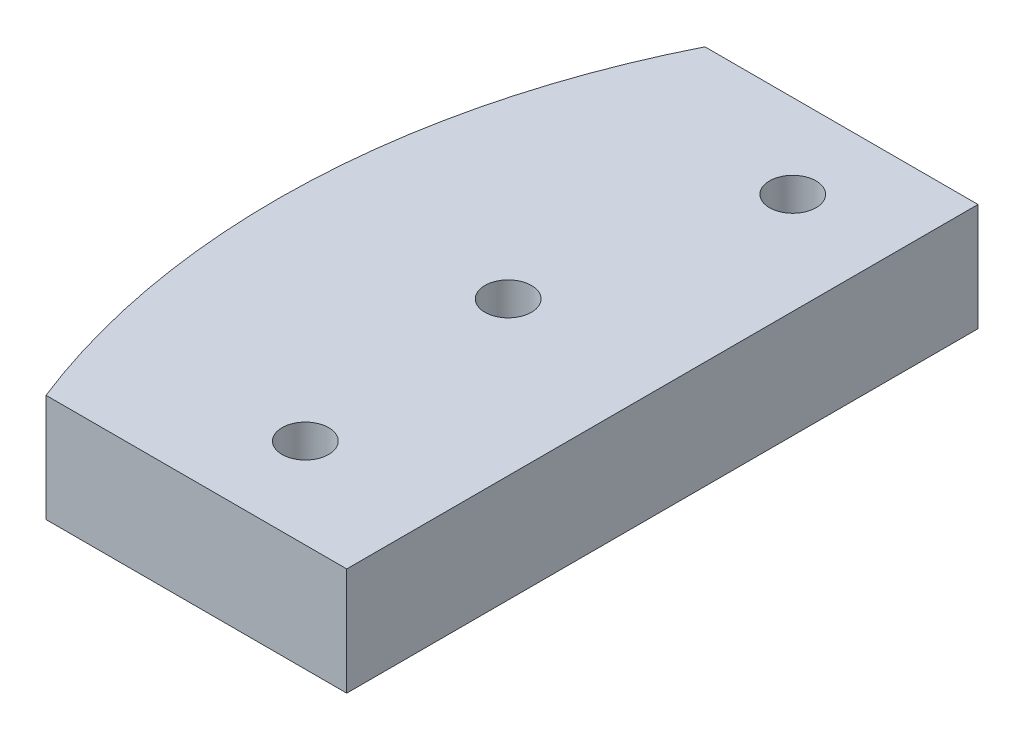
ISO-10303-21;
HEADER;
FILE_DESCRIPTION(('STEP AP214'),'2;1');
FILE_NAME('part.step','',(''),(''),'','','');
FILE_SCHEMA(('AUTOMOTIVE_DESIGN { 1 0 10303 214 1 1 1 1 }'));
ENDSEC;
DATA;
#1=APPLICATION_CONTEXT('core data for automotive mechanical design processes');
#2=APPLICATION_PROTOCOL_DEFINITION('international standard','automotive_design',2000,#1);
#3=PRODUCT_CONTEXT('',#1,'mechanical');
#4=PRODUCT('Part','Part','',(#3));
#5=PRODUCT_RELATED_PRODUCT_CATEGORY('part','',(#4));
#6=PRODUCT_DEFINITION_FORMATION('','',#4);
#7=PRODUCT_DEFINITION_CONTEXT('part definition',#1,'design');
#8=PRODUCT_DEFINITION('design','',#6,#7);
#9=PRODUCT_DEFINITION_SHAPE('','',#8);
#10=(LENGTH_UNIT() NAMED_UNIT(*) SI_UNIT(.MILLI.,.METRE.));
#11=(NAMED_UNIT(*) PLANE_ANGLE_UNIT() SI_UNIT($,.RADIAN.));
#12=(NAMED_UNIT(*) SI_UNIT($,.STERADIAN.) SOLID_ANGLE_UNIT());
#13=UNCERTAINTY_MEASURE_WITH_UNIT(LENGTH_MEASURE(1.E-05),#10,'distance_accuracy_value','');
#14=(GEOMETRIC_REPRESENTATION_CONTEXT(3) GLOBAL_UNCERTAINTY_ASSIGNED_CONTEXT((#13)) GLOBAL_UNIT_ASSIGNED_CONTEXT((#10,
#11,#12)) REPRESENTATION_CONTEXT('',''));
#15=CARTESIAN_POINT('',(0.,0.,0.));
#16=DIRECTION('',(0.,0.,1.));
#17=DIRECTION('',(1.,0.,0.));
#18=AXIS2_PLACEMENT_3D('',#15,#16,#17);
#19=CARTESIAN_POINT('',(-40.2,15.,12.9987228872584));
#20=DIRECTION('',(0.,1.,0.));
#21=DIRECTION('',(-1.,0.,0.));
#22=AXIS2_PLACEMENT_3D('',#19,#20,#21);
#23=PLANE('',#22);
#24=CARTESIAN_POINT('',(-78.,15.,0.100000000000003));
#25=DIRECTION('',(0.,1.,0.));
#26=DIRECTION('',(-1.,0.,0.));
#27=AXIS2_PLACEMENT_3D('',#24,#25,#26);
#28=CIRCLE('',#27,2.25);
#29=CARTESIAN_POINT('',(-80.25,15.,0.100000000000003));
#30=VERTEX_POINT('',#29);
#31=EDGE_CURVE('E125',#30,#30,#28,.F.);
#32=ORIENTED_EDGE('',*,*,#31,.F.);
#33=EDGE_LOOP('',(#32));
#34=FACE_BOUND('',#33,.T.);
#35=DIRECTION('',(0.,0.,1.));
#36=VECTOR('',#35,1.);
#37=CARTESIAN_POINT('',(-63.2,15.,-33.5));
#38=LINE('',#37,#36);
#39=CARTESIAN_POINT('',(-63.2,15.,-30.5));
#40=VERTEX_POINT('',#39);
#41=CARTESIAN_POINT('',(-63.2,15.,30.5));
#42=VERTEX_POINT('',#41);
#43=EDGE_CURVE('E14',#40,#42,#38,.T.);
#44=ORIENTED_EDGE('',*,*,#43,.T.);
#45=DIRECTION('',(1.,0.,0.));
#46=VECTOR('',#45,1.);
#47=CARTESIAN_POINT('',(0.,15.,30.5));
#48=LINE('',#47,#46);
#49=CARTESIAN_POINT('',(-92.2616921937509,15.,30.5));
#50=VERTEX_POINT('',#49);
#51=EDGE_CURVE('E70',#50,#42,#48,.T.);
#52=ORIENTED_EDGE('',*,*,#51,.F.);
#53=CARTESIAN_POINT('',(-22.6589151875398,15.,2.99288439458776));
#54=DIRECTION('',(0.,1.,0.));
#55=DIRECTION('',(-1.,0.,0.));
#56=AXIS2_PLACEMENT_3D('',#53,#54,#55);
#57=CIRCLE('',#56,74.8410848124602);
#58=CARTESIAN_POINT('',(-89.5873446539231,15.,-30.5));
#59=VERTEX_POINT('',#58);
#60=EDGE_CURVE('E133',#50,#59,#57,.F.);
#61=ORIENTED_EDGE('',*,*,#60,.T.);
#62=DIRECTION('',(1.,0.,0.));
#63=VECTOR('',#62,1.);
#64=CARTESIAN_POINT('',(0.,15.,-30.5));
#65=LINE('',#64,#63);
#66=EDGE_CURVE('E62',#59,#40,#65,.T.);
#67=ORIENTED_EDGE('',*,*,#66,.T.);
#68=EDGE_LOOP('',(#44,#52,#61,#67));
#69=FACE_BOUND('',#68,.T.);
#70=CARTESIAN_POINT('',(-73.,15.,-22.4));
#71=DIRECTION('',(0.,1.,0.));
#72=DIRECTION('',(-1.,0.,0.));
#73=AXIS2_PLACEMENT_3D('',#70,#71,#72);
#74=CIRCLE('',#73,2.25);
#75=CARTESIAN_POINT('',(-75.25,15.,-22.4));
#76=VERTEX_POINT('',#75);
#77=EDGE_CURVE('E119',#76,#76,#74,.F.);
#78=ORIENTED_EDGE('',*,*,#77,.F.);
#79=EDGE_LOOP('',(#78));
#80=FACE_BOUND('',#79,.T.);
#81=CARTESIAN_POINT('',(-75.9,15.,21.8));
#82=DIRECTION('',(0.,1.,0.));
#83=DIRECTION('',(-1.,0.,0.));
#84=AXIS2_PLACEMENT_3D('',#81,#82,#83);
#85=CIRCLE('',#84,2.25);
#86=CARTESIAN_POINT('',(-78.15,15.,21.8));
#87=VERTEX_POINT('',#86);
#88=EDGE_CURVE('E56',#87,#87,#85,.F.);
#89=ORIENTED_EDGE('',*,*,#88,.F.);
#90=EDGE_LOOP('',(#89));
#91=FACE_BOUND('',#90,.T.);
#92=ADVANCED_FACE('F53',(#34,#69,#80,#91),#23,.F.);
#93=CARTESIAN_POINT('',(0.,25.4,0.));
#94=DIRECTION('',(0.,-1.,0.));
#95=DIRECTION('',(0.,0.,-1.));
#96=AXIS2_PLACEMENT_3D('',#93,#94,#95);
#97=PLANE('',#96);
#98=CARTESIAN_POINT('',(-73.,25.4,-22.4));
#99=DIRECTION('',(0.,-1.,0.));
#100=DIRECTION('',(0.,0.,-1.));
#101=AXIS2_PLACEMENT_3D('',#98,#99,#100);
#102=CIRCLE('',#101,2.25);
#103=CARTESIAN_POINT('',(-73.,25.4,-24.65));
#104=VERTEX_POINT('',#103);
#105=EDGE_CURVE('E269',#104,#104,#102,.T.);
#106=ORIENTED_EDGE('',*,*,#105,.T.);
#107=EDGE_LOOP('',(#106));
#108=FACE_BOUND('',#107,.T.);
#109=CARTESIAN_POINT('',(-78.,25.4,0.100000000000003));
#110=DIRECTION('',(0.,-1.,0.));
#111=DIRECTION('',(0.,0.,-1.));
#112=AXIS2_PLACEMENT_3D('',#109,#110,#111);
#113=CIRCLE('',#112,2.25);
#114=CARTESIAN_POINT('',(-78.,25.4,-2.14999999999999));
#115=VERTEX_POINT('',#114);
#116=EDGE_CURVE('E272',#115,#115,#113,.T.);
#117=ORIENTED_EDGE('',*,*,#116,.T.);
#118=EDGE_LOOP('',(#117));
#119=FACE_BOUND('',#118,.T.);
#120=CARTESIAN_POINT('',(-75.9,25.4,21.8));
#121=DIRECTION('',(0.,-1.,0.));
#122=DIRECTION('',(0.,0.,-1.));
#123=AXIS2_PLACEMENT_3D('',#120,#121,#122);
#124=CIRCLE('',#123,2.25);
#125=CARTESIAN_POINT('',(-75.9,25.4,19.55));
#126=VERTEX_POINT('',#125);
#127=EDGE_CURVE('E267',#126,#126,#124,.T.);
#128=ORIENTED_EDGE('',*,*,#127,.T.);
#129=EDGE_LOOP('',(#128));
#130=FACE_BOUND('',#129,.T.);
#131=DIRECTION('',(-1.,0.,0.));
#132=VECTOR('',#131,1.);
#133=CARTESIAN_POINT('',(0.,25.4,-30.5));
#134=LINE('',#133,#132);
#135=CARTESIAN_POINT('',(-63.2,25.4,-30.5));
#136=VERTEX_POINT('',#135);
#137=CARTESIAN_POINT('',(-89.5873446539231,25.4,-30.5));
#138=VERTEX_POINT('',#137);
#139=EDGE_CURVE('E98',#136,#138,#134,.T.);
#140=ORIENTED_EDGE('',*,*,#139,.T.);
#141=CARTESIAN_POINT('',(-22.6589151875398,25.4,2.99288439458776));
#142=DIRECTION('',(0.,-1.,0.));
#143=DIRECTION('',(0.,0.,-1.));
#144=AXIS2_PLACEMENT_3D('',#141,#142,#143);
#145=CIRCLE('',#144,74.8410848124602);
#146=CARTESIAN_POINT('',(-92.2616921937509,25.4,30.5));
#147=VERTEX_POINT('',#146);
#148=EDGE_CURVE('E110',#147,#138,#145,.T.);
#149=ORIENTED_EDGE('',*,*,#148,.F.);
#150=DIRECTION('',(-1.,0.,0.));
#151=VECTOR('',#150,1.);
#152=CARTESIAN_POINT('',(0.,25.4,30.5));
#153=LINE('',#152,#151);
#154=CARTESIAN_POINT('',(-63.2,25.4,30.5));
#155=VERTEX_POINT('',#154);
#156=EDGE_CURVE('E266',#155,#147,#153,.T.);
#157=ORIENTED_EDGE('',*,*,#156,.F.);
#158=DIRECTION('',(0.,0.,1.));
#159=VECTOR('',#158,1.);
#160=CARTESIAN_POINT('',(-63.2,25.4,-33.5));
#161=LINE('',#160,#159);
#162=EDGE_CURVE('E112',#136,#155,#161,.T.);
#163=ORIENTED_EDGE('',*,*,#162,.F.);
#164=EDGE_LOOP('',(#140,#149,#157,#163));
#165=FACE_BOUND('',#164,.T.);
#166=ADVANCED_FACE('F108',(#108,#119,#130,#165),#97,.F.);
#167=CARTESIAN_POINT('',(-22.6589151875398,25.4,2.99288439458776));
#168=DIRECTION('',(0.,-1.,0.));
#169=DIRECTION('',(0.,0.,-1.));
#170=AXIS2_PLACEMENT_3D('',#167,#168,#169);
#171=CYLINDRICAL_SURFACE('',#170,74.8410848124602);
#172=ORIENTED_EDGE('',*,*,#60,.F.);
#173=DIRECTION('',(0.,1.,0.));
#174=VECTOR('',#173,1.);
#175=CARTESIAN_POINT('',(-92.2616921937509,12.4,30.5));
#176=LINE('',#175,#174);
#177=EDGE_CURVE('E114',#50,#147,#176,.T.);
#178=ORIENTED_EDGE('',*,*,#177,.T.);
#179=ORIENTED_EDGE('',*,*,#148,.T.);
#180=DIRECTION('',(0.,1.,0.));
#181=VECTOR('',#180,1.);
#182=CARTESIAN_POINT('',(-89.5873446539231,12.4,-30.5));
#183=LINE('',#182,#181);
#184=EDGE_CURVE('E94',#59,#138,#183,.T.);
#185=ORIENTED_EDGE('',*,*,#184,.F.);
#186=EDGE_LOOP('',(#172,#178,#179,#185));
#187=FACE_BOUND('',#186,.T.);
#188=ADVANCED_FACE('F116',(#187),#171,.T.);
#189=CARTESIAN_POINT('',(-63.2,0.,-33.5));
#190=DIRECTION('',(-1.,0.,0.));
#191=DIRECTION('',(0.,-1.,0.));
#192=AXIS2_PLACEMENT_3D('',#189,#190,#191);
#193=PLANE('',#192);
#194=DIRECTION('',(0.,-1.,0.));
#195=VECTOR('',#194,1.);
#196=CARTESIAN_POINT('',(-63.2,0.,-30.5));
#197=LINE('',#196,#195);
#198=EDGE_CURVE('E128',#136,#40,#197,.T.);
#199=ORIENTED_EDGE('',*,*,#198,.F.);
#200=ORIENTED_EDGE('',*,*,#162,.T.);
#201=DIRECTION('',(0.,-1.,0.));
#202=VECTOR('',#201,1.);
#203=CARTESIAN_POINT('',(-63.2,0.,30.5));
#204=LINE('',#203,#202);
#205=EDGE_CURVE('E103',#155,#42,#204,.T.);
#206=ORIENTED_EDGE('',*,*,#205,.T.);
#207=ORIENTED_EDGE('',*,*,#43,.F.);
#208=EDGE_LOOP('',(#199,#200,#206,#207));
#209=FACE_BOUND('',#208,.T.);
#210=ADVANCED_FACE('F174',(#209),#193,.F.);
#211=CARTESIAN_POINT('',(0.,12.4,30.5));
#212=DIRECTION('',(0.,0.,-1.));
#213=DIRECTION('',(-1.,0.,0.));
#214=AXIS2_PLACEMENT_3D('',#211,#212,#213);
#215=PLANE('',#214);
#216=ORIENTED_EDGE('',*,*,#177,.F.);
#217=ORIENTED_EDGE('',*,*,#51,.T.);
#218=ORIENTED_EDGE('',*,*,#205,.F.);
#219=ORIENTED_EDGE('',*,*,#156,.T.);
#220=EDGE_LOOP('',(#216,#217,#218,#219));
#221=FACE_BOUND('',#220,.T.);
#222=ADVANCED_FACE('F171',(#221),#215,.F.);
#223=CARTESIAN_POINT('',(0.,12.4,-30.5));
#224=DIRECTION('',(0.,0.,-1.));
#225=DIRECTION('',(-1.,0.,0.));
#226=AXIS2_PLACEMENT_3D('',#223,#224,#225);
#227=PLANE('',#226);
#228=ORIENTED_EDGE('',*,*,#66,.F.);
#229=ORIENTED_EDGE('',*,*,#184,.T.);
#230=ORIENTED_EDGE('',*,*,#139,.F.);
#231=ORIENTED_EDGE('',*,*,#198,.T.);
#232=EDGE_LOOP('',(#228,#229,#230,#231));
#233=FACE_BOUND('',#232,.T.);
#234=ADVANCED_FACE('F96',(#233),#227,.T.);
#235=CARTESIAN_POINT('',(-75.9,25.4,21.8));
#236=DIRECTION('',(0.,-1.,0.));
#237=DIRECTION('',(0.,0.,-1.));
#238=AXIS2_PLACEMENT_3D('',#235,#236,#237);
#239=CYLINDRICAL_SURFACE('',#238,2.25);
#240=ORIENTED_EDGE('',*,*,#88,.T.);
#241=EDGE_LOOP('',(#240));
#242=FACE_BOUND('',#241,.T.);
#243=ORIENTED_EDGE('',*,*,#127,.F.);
#244=EDGE_LOOP('',(#243));
#245=FACE_BOUND('',#244,.T.);
#246=ADVANCED_FACE('F148',(#242,#245),#239,.F.);
#247=CARTESIAN_POINT('',(-78.,25.4,0.100000000000003));
#248=DIRECTION('',(0.,-1.,0.));
#249=DIRECTION('',(0.,0.,-1.));
#250=AXIS2_PLACEMENT_3D('',#247,#248,#249);
#251=CYLINDRICAL_SURFACE('',#250,2.25);
#252=ORIENTED_EDGE('',*,*,#31,.T.);
#253=EDGE_LOOP('',(#252));
#254=FACE_BOUND('',#253,.T.);
#255=ORIENTED_EDGE('',*,*,#116,.F.);
#256=EDGE_LOOP('',(#255));
#257=FACE_BOUND('',#256,.T.);
#258=ADVANCED_FACE('F159',(#254,#257),#251,.F.);
#259=CARTESIAN_POINT('',(-73.,25.4,-22.4));
#260=DIRECTION('',(0.,-1.,0.));
#261=DIRECTION('',(0.,0.,-1.));
#262=AXIS2_PLACEMENT_3D('',#259,#260,#261);
#263=CYLINDRICAL_SURFACE('',#262,2.25);
#264=ORIENTED_EDGE('',*,*,#77,.T.);
#265=EDGE_LOOP('',(#264));
#266=FACE_BOUND('',#265,.T.);
#267=ORIENTED_EDGE('',*,*,#105,.F.);
#268=EDGE_LOOP('',(#267));
#269=FACE_BOUND('',#268,.T.);
#270=ADVANCED_FACE('F153',(#266,#269),#263,.F.);
#271=CLOSED_SHELL('',(#92,#166,#188,#210,#222,#234,#246,#258,#270));
#272=MANIFOLD_SOLID_BREP('B2',#271);
#273=ADVANCED_BREP_SHAPE_REPRESENTATION('',(#18,#272),#14);
#274=SHAPE_DEFINITION_REPRESENTATION(#9,#273);
ENDSEC;
END-ISO-10303-21;
